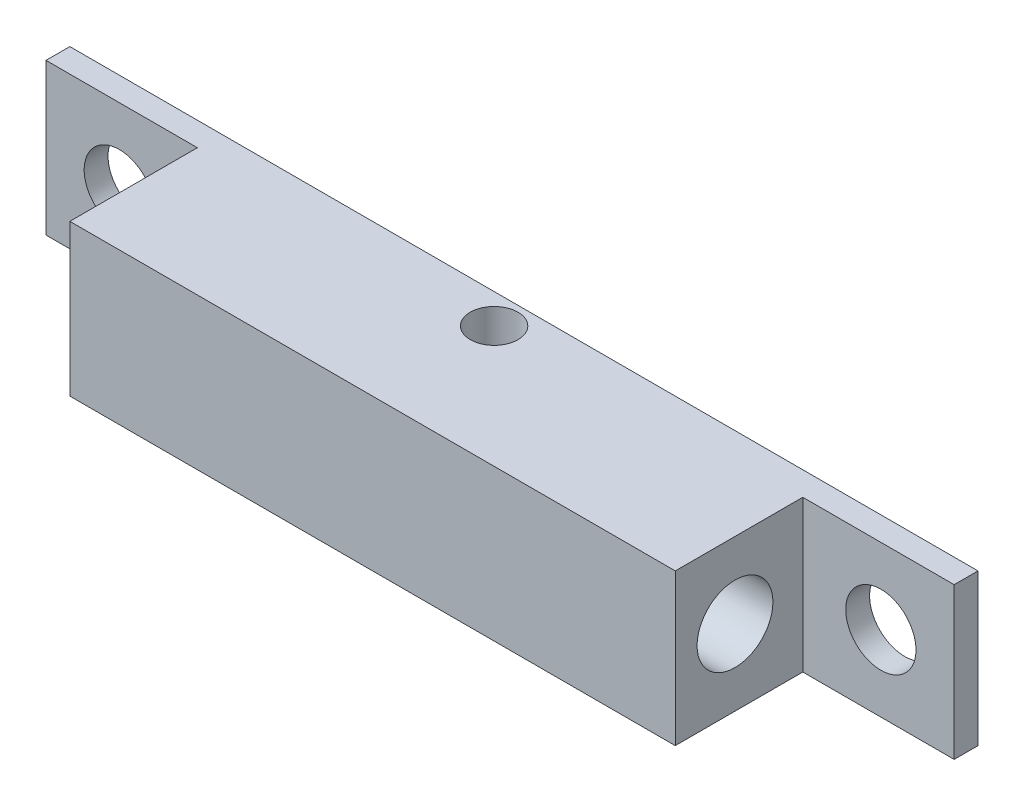
ISO-10303-21;
HEADER;
FILE_DESCRIPTION(('STEP AP214'),'2;1');
FILE_NAME('part.step','',(''),(''),'','','');
FILE_SCHEMA(('AUTOMOTIVE_DESIGN { 1 0 10303 214 1 1 1 1 }'));
ENDSEC;
DATA;
#1=APPLICATION_CONTEXT('core data for automotive mechanical design processes');
#2=APPLICATION_PROTOCOL_DEFINITION('international standard','automotive_design',2000,#1);
#3=PRODUCT_CONTEXT('',#1,'mechanical');
#4=PRODUCT('Part','Part','',(#3));
#5=PRODUCT_RELATED_PRODUCT_CATEGORY('part','',(#4));
#6=PRODUCT_DEFINITION_FORMATION('','',#4);
#7=PRODUCT_DEFINITION_CONTEXT('part definition',#1,'design');
#8=PRODUCT_DEFINITION('design','',#6,#7);
#9=PRODUCT_DEFINITION_SHAPE('','',#8);
#10=(LENGTH_UNIT() NAMED_UNIT(*) SI_UNIT(.MILLI.,.METRE.));
#11=(NAMED_UNIT(*) PLANE_ANGLE_UNIT() SI_UNIT($,.RADIAN.));
#12=(NAMED_UNIT(*) SI_UNIT($,.STERADIAN.) SOLID_ANGLE_UNIT());
#13=UNCERTAINTY_MEASURE_WITH_UNIT(LENGTH_MEASURE(1.E-05),#10,'distance_accuracy_value','');
#14=(GEOMETRIC_REPRESENTATION_CONTEXT(3) GLOBAL_UNCERTAINTY_ASSIGNED_CONTEXT((#13)) GLOBAL_UNIT_ASSIGNED_CONTEXT((#10,
#11,#12)) REPRESENTATION_CONTEXT('',''));
#15=CARTESIAN_POINT('',(0.,0.,0.));
#16=DIRECTION('',(0.,0.,1.));
#17=DIRECTION('',(1.,0.,0.));
#18=AXIS2_PLACEMENT_3D('',#15,#16,#17);
#19=CARTESIAN_POINT('',(0.,0.,1.));
#20=DIRECTION('',(0.,-1.,0.));
#21=DIRECTION('',(0.,0.,-1.));
#22=AXIS2_PLACEMENT_3D('',#19,#20,#21);
#23=PLANE('',#22);
#24=CARTESIAN_POINT('',(12.7,0.,1.25));
#25=DIRECTION('',(0.,1.,0.));
#26=DIRECTION('',(0.,0.,1.));
#27=AXIS2_PLACEMENT_3D('',#24,#25,#26);
#28=CIRCLE('',#27,1.);
#29=CARTESIAN_POINT('',(12.7,0.,2.25));
#30=VERTEX_POINT('',#29);
#31=EDGE_CURVE('E248',#30,#30,#28,.T.);
#32=ORIENTED_EDGE('',*,*,#31,.F.);
#33=EDGE_LOOP('',(#32));
#34=FACE_BOUND('',#33,.T.);
#35=DIRECTION('',(-1.,0.,0.));
#36=VECTOR('',#35,1.);
#37=CARTESIAN_POINT('',(0.,0.,0.));
#38=LINE('',#37,#36);
#39=CARTESIAN_POINT('',(31.75,0.,0.));
#40=VERTEX_POINT('',#39);
#41=CARTESIAN_POINT('',(-6.35,0.,0.));
#42=VERTEX_POINT('',#41);
#43=EDGE_CURVE('E180',#40,#42,#38,.T.);
#44=ORIENTED_EDGE('',*,*,#43,.T.);
#45=DIRECTION('',(0.,0.,-1.));
#46=VECTOR('',#45,1.);
#47=CARTESIAN_POINT('',(-6.35,0.,1.));
#48=LINE('',#47,#46);
#49=CARTESIAN_POINT('',(-6.35,0.,1.));
#50=VERTEX_POINT('',#49);
#51=EDGE_CURVE('E11',#50,#42,#48,.T.);
#52=ORIENTED_EDGE('',*,*,#51,.F.);
#53=DIRECTION('',(-1.,0.,0.));
#54=VECTOR('',#53,1.);
#55=CARTESIAN_POINT('',(0.,0.,1.));
#56=LINE('',#55,#54);
#57=CARTESIAN_POINT('',(0.,0.,1.));
#58=VERTEX_POINT('',#57);
#59=EDGE_CURVE('E66',#58,#50,#56,.T.);
#60=ORIENTED_EDGE('',*,*,#59,.F.);
#61=DIRECTION('',(0.,0.,-1.));
#62=VECTOR('',#61,1.);
#63=CARTESIAN_POINT('',(0.,0.,6.35));
#64=LINE('',#63,#62);
#65=CARTESIAN_POINT('',(0.,0.,6.35));
#66=VERTEX_POINT('',#65);
#67=EDGE_CURVE('E162',#66,#58,#64,.T.);
#68=ORIENTED_EDGE('',*,*,#67,.F.);
#69=DIRECTION('',(1.,0.,0.));
#70=VECTOR('',#69,1.);
#71=CARTESIAN_POINT('',(0.,0.,6.35));
#72=LINE('',#71,#70);
#73=CARTESIAN_POINT('',(25.4,0.,6.35));
#74=VERTEX_POINT('',#73);
#75=EDGE_CURVE('E151',#66,#74,#72,.T.);
#76=ORIENTED_EDGE('',*,*,#75,.T.);
#77=DIRECTION('',(0.,0.,-1.));
#78=VECTOR('',#77,1.);
#79=CARTESIAN_POINT('',(25.4,0.,6.35));
#80=LINE('',#79,#78);
#81=CARTESIAN_POINT('',(25.4,0.,1.));
#82=VERTEX_POINT('',#81);
#83=EDGE_CURVE('E137',#74,#82,#80,.T.);
#84=ORIENTED_EDGE('',*,*,#83,.T.);
#85=DIRECTION('',(1.,0.,0.));
#86=VECTOR('',#85,1.);
#87=CARTESIAN_POINT('',(0.,0.,1.));
#88=LINE('',#87,#86);
#89=CARTESIAN_POINT('',(31.75,0.,1.));
#90=VERTEX_POINT('',#89);
#91=EDGE_CURVE('E130',#82,#90,#88,.T.);
#92=ORIENTED_EDGE('',*,*,#91,.T.);
#93=DIRECTION('',(0.,0.,-1.));
#94=VECTOR('',#93,1.);
#95=CARTESIAN_POINT('',(31.75,0.,1.));
#96=LINE('',#95,#94);
#97=EDGE_CURVE('E115',#90,#40,#96,.T.);
#98=ORIENTED_EDGE('',*,*,#97,.T.);
#99=EDGE_LOOP('',(#44,#52,#60,#68,#76,#84,#92,#98));
#100=FACE_BOUND('',#99,.T.);
#101=ADVANCED_FACE('F42',(#34,#100),#23,.F.);
#102=CARTESIAN_POINT('',(-6.35,0.,1.));
#103=DIRECTION('',(1.,0.,0.));
#104=DIRECTION('',(0.,1.,0.));
#105=AXIS2_PLACEMENT_3D('',#102,#103,#104);
#106=PLANE('',#105);
#107=DIRECTION('',(0.,-1.,0.));
#108=VECTOR('',#107,1.);
#109=CARTESIAN_POINT('',(-6.35,0.,0.));
#110=LINE('',#109,#108);
#111=CARTESIAN_POINT('',(-6.35,-6.35,0.));
#112=VERTEX_POINT('',#111);
#113=EDGE_CURVE('E182',#42,#112,#110,.T.);
#114=ORIENTED_EDGE('',*,*,#113,.T.);
#115=DIRECTION('',(0.,0.,-1.));
#116=VECTOR('',#115,1.);
#117=CARTESIAN_POINT('',(-6.35,-6.35,1.));
#118=LINE('',#117,#116);
#119=CARTESIAN_POINT('',(-6.35,-6.35,1.));
#120=VERTEX_POINT('',#119);
#121=EDGE_CURVE('E50',#120,#112,#118,.T.);
#122=ORIENTED_EDGE('',*,*,#121,.F.);
#123=DIRECTION('',(0.,-1.,0.));
#124=VECTOR('',#123,1.);
#125=CARTESIAN_POINT('',(-6.35,0.,1.));
#126=LINE('',#125,#124);
#127=EDGE_CURVE('E85',#50,#120,#126,.T.);
#128=ORIENTED_EDGE('',*,*,#127,.F.);
#129=ORIENTED_EDGE('',*,*,#51,.T.);
#130=EDGE_LOOP('',(#114,#122,#128,#129));
#131=FACE_BOUND('',#130,.T.);
#132=ADVANCED_FACE('F202',(#131),#106,.F.);
#133=CARTESIAN_POINT('',(0.,-6.35,1.));
#134=DIRECTION('',(0.,-1.,0.));
#135=DIRECTION('',(1.,0.,0.));
#136=AXIS2_PLACEMENT_3D('',#133,#134,#135);
#137=PLANE('',#136);
#138=CARTESIAN_POINT('',(12.7,-6.35,1.25));
#139=DIRECTION('',(0.,-1.,0.));
#140=DIRECTION('',(1.,0.,0.));
#141=AXIS2_PLACEMENT_3D('',#138,#139,#140);
#142=CIRCLE('',#141,1.);
#143=CARTESIAN_POINT('',(13.7,-6.35,1.25));
#144=VERTEX_POINT('',#143);
#145=EDGE_CURVE('E251',#144,#144,#142,.F.);
#146=ORIENTED_EDGE('',*,*,#145,.T.);
#147=EDGE_LOOP('',(#146));
#148=FACE_BOUND('',#147,.T.);
#149=DIRECTION('',(-1.,0.,0.));
#150=VECTOR('',#149,1.);
#151=CARTESIAN_POINT('',(0.,-6.35,0.));
#152=LINE('',#151,#150);
#153=CARTESIAN_POINT('',(31.75,-6.35000000000001,0.));
#154=VERTEX_POINT('',#153);
#155=EDGE_CURVE('E170',#154,#112,#152,.T.);
#156=ORIENTED_EDGE('',*,*,#155,.F.);
#157=DIRECTION('',(0.,0.,-1.));
#158=VECTOR('',#157,1.);
#159=CARTESIAN_POINT('',(31.75,-6.35000000000001,1.));
#160=LINE('',#159,#158);
#161=CARTESIAN_POINT('',(31.75,-6.35000000000001,1.));
#162=VERTEX_POINT('',#161);
#163=EDGE_CURVE('E125',#162,#154,#160,.T.);
#164=ORIENTED_EDGE('',*,*,#163,.F.);
#165=DIRECTION('',(1.,0.,0.));
#166=VECTOR('',#165,1.);
#167=CARTESIAN_POINT('',(0.,-6.35,1.));
#168=LINE('',#167,#166);
#169=CARTESIAN_POINT('',(25.4,-6.35000000000001,1.));
#170=VERTEX_POINT('',#169);
#171=EDGE_CURVE('E132',#170,#162,#168,.T.);
#172=ORIENTED_EDGE('',*,*,#171,.F.);
#173=DIRECTION('',(0.,0.,-1.));
#174=VECTOR('',#173,1.);
#175=CARTESIAN_POINT('',(25.4,-6.35000000000001,6.35));
#176=LINE('',#175,#174);
#177=CARTESIAN_POINT('',(25.4,-6.35000000000001,6.35));
#178=VERTEX_POINT('',#177);
#179=EDGE_CURVE('E157',#178,#170,#176,.T.);
#180=ORIENTED_EDGE('',*,*,#179,.F.);
#181=DIRECTION('',(1.,0.,0.));
#182=VECTOR('',#181,1.);
#183=CARTESIAN_POINT('',(0.,-6.35,6.35));
#184=LINE('',#183,#182);
#185=CARTESIAN_POINT('',(0.,-6.35,6.35));
#186=VERTEX_POINT('',#185);
#187=EDGE_CURVE('E155',#186,#178,#184,.T.);
#188=ORIENTED_EDGE('',*,*,#187,.F.);
#189=DIRECTION('',(0.,0.,-1.));
#190=VECTOR('',#189,1.);
#191=CARTESIAN_POINT('',(0.,-6.35,6.35));
#192=LINE('',#191,#190);
#193=CARTESIAN_POINT('',(0.,-6.35,1.));
#194=VERTEX_POINT('',#193);
#195=EDGE_CURVE('E159',#186,#194,#192,.T.);
#196=ORIENTED_EDGE('',*,*,#195,.T.);
#197=DIRECTION('',(-1.,0.,0.));
#198=VECTOR('',#197,1.);
#199=CARTESIAN_POINT('',(0.,-6.35,1.));
#200=LINE('',#199,#198);
#201=EDGE_CURVE('E173',#194,#120,#200,.T.);
#202=ORIENTED_EDGE('',*,*,#201,.T.);
#203=ORIENTED_EDGE('',*,*,#121,.T.);
#204=EDGE_LOOP('',(#156,#164,#172,#180,#188,#196,#202,#203));
#205=FACE_BOUND('',#204,.T.);
#206=ADVANCED_FACE('F188',(#148,#205),#137,.T.);
#207=CARTESIAN_POINT('',(-3.275,-3.17500000000001,1.));
#208=DIRECTION('',(0.,0.,-1.));
#209=DIRECTION('',(-1.,0.,0.));
#210=AXIS2_PLACEMENT_3D('',#207,#208,#209);
#211=CYLINDRICAL_SURFACE('',#210,1.4732);
#212=CARTESIAN_POINT('',(-3.275,-3.17500000000001,1.));
#213=DIRECTION('',(0.,0.,1.));
#214=DIRECTION('',(1.,0.,0.));
#215=AXIS2_PLACEMENT_3D('',#212,#213,#214);
#216=CIRCLE('',#215,1.4732);
#217=CARTESIAN_POINT('',(-1.8018,-3.17500000000001,1.));
#218=VERTEX_POINT('',#217);
#219=EDGE_CURVE('E167',#218,#218,#216,.T.);
#220=ORIENTED_EDGE('',*,*,#219,.T.);
#221=EDGE_LOOP('',(#220));
#222=FACE_BOUND('',#221,.T.);
#223=CARTESIAN_POINT('',(-3.275,-3.17500000000001,0.));
#224=DIRECTION('',(0.,0.,1.));
#225=DIRECTION('',(1.,0.,0.));
#226=AXIS2_PLACEMENT_3D('',#223,#224,#225);
#227=CIRCLE('',#226,1.4732);
#228=CARTESIAN_POINT('',(-1.8018,-3.17500000000001,0.));
#229=VERTEX_POINT('',#228);
#230=EDGE_CURVE('E166',#229,#229,#227,.T.);
#231=ORIENTED_EDGE('',*,*,#230,.F.);
#232=EDGE_LOOP('',(#231));
#233=FACE_BOUND('',#232,.T.);
#234=ADVANCED_FACE('F44',(#222,#233),#211,.F.);
#235=CARTESIAN_POINT('',(0.,0.,1.));
#236=DIRECTION('',(0.,0.,1.));
#237=DIRECTION('',(1.,0.,0.));
#238=AXIS2_PLACEMENT_3D('',#235,#236,#237);
#239=PLANE('',#238);
#240=ORIENTED_EDGE('',*,*,#219,.F.);
#241=EDGE_LOOP('',(#240));
#242=FACE_BOUND('',#241,.T.);
#243=ORIENTED_EDGE('',*,*,#59,.T.);
#244=ORIENTED_EDGE('',*,*,#127,.T.);
#245=ORIENTED_EDGE('',*,*,#201,.F.);
#246=DIRECTION('',(0.,-1.,0.));
#247=VECTOR('',#246,1.);
#248=CARTESIAN_POINT('',(0.,0.,1.));
#249=LINE('',#248,#247);
#250=EDGE_CURVE('E175',#58,#194,#249,.T.);
#251=ORIENTED_EDGE('',*,*,#250,.F.);
#252=EDGE_LOOP('',(#243,#244,#245,#251));
#253=FACE_BOUND('',#252,.T.);
#254=ADVANCED_FACE('F201',(#242,#253),#239,.T.);
#255=CARTESIAN_POINT('',(0.,0.,0.));
#256=DIRECTION('',(0.,0.,1.));
#257=DIRECTION('',(1.,0.,0.));
#258=AXIS2_PLACEMENT_3D('',#255,#256,#257);
#259=PLANE('',#258);
#260=ORIENTED_EDGE('',*,*,#230,.T.);
#261=EDGE_LOOP('',(#260));
#262=FACE_BOUND('',#261,.T.);
#263=ORIENTED_EDGE('',*,*,#43,.F.);
#264=DIRECTION('',(0.,-1.,0.));
#265=VECTOR('',#264,1.);
#266=CARTESIAN_POINT('',(31.75,0.,0.));
#267=LINE('',#266,#265);
#268=EDGE_CURVE('E121',#40,#154,#267,.T.);
#269=ORIENTED_EDGE('',*,*,#268,.T.);
#270=ORIENTED_EDGE('',*,*,#155,.T.);
#271=ORIENTED_EDGE('',*,*,#113,.F.);
#272=EDGE_LOOP('',(#263,#269,#270,#271));
#273=FACE_BOUND('',#272,.T.);
#274=CARTESIAN_POINT('',(28.675,-3.17500000000001,0.));
#275=DIRECTION('',(0.,0.,1.));
#276=DIRECTION('',(1.,0.,0.));
#277=AXIS2_PLACEMENT_3D('',#274,#275,#276);
#278=CIRCLE('',#277,1.4732);
#279=CARTESIAN_POINT('',(30.1482,-3.17500000000001,0.));
#280=VERTEX_POINT('',#279);
#281=EDGE_CURVE('E143',#280,#280,#278,.T.);
#282=ORIENTED_EDGE('',*,*,#281,.T.);
#283=EDGE_LOOP('',(#282));
#284=FACE_BOUND('',#283,.T.);
#285=ADVANCED_FACE('F186',(#262,#273,#284),#259,.F.);
#286=CARTESIAN_POINT('',(0.,0.,6.35));
#287=DIRECTION('',(1.,0.,0.));
#288=DIRECTION('',(0.,1.,0.));
#289=AXIS2_PLACEMENT_3D('',#286,#287,#288);
#290=PLANE('',#289);
#291=CARTESIAN_POINT('',(0.,-3.175,3.8448));
#292=DIRECTION('',(-1.,0.,0.));
#293=DIRECTION('',(0.,-1.,0.));
#294=AXIS2_PLACEMENT_3D('',#291,#292,#293);
#295=CIRCLE('',#294,1.591);
#296=CARTESIAN_POINT('',(0.,-4.766,3.8448));
#297=VERTEX_POINT('',#296);
#298=EDGE_CURVE('E252',#297,#297,#295,.T.);
#299=ORIENTED_EDGE('',*,*,#298,.F.);
#300=EDGE_LOOP('',(#299));
#301=FACE_BOUND('',#300,.T.);
#302=ORIENTED_EDGE('',*,*,#67,.T.);
#303=ORIENTED_EDGE('',*,*,#250,.T.);
#304=ORIENTED_EDGE('',*,*,#195,.F.);
#305=DIRECTION('',(0.,-1.,0.));
#306=VECTOR('',#305,1.);
#307=CARTESIAN_POINT('',(0.,0.,6.35));
#308=LINE('',#307,#306);
#309=EDGE_CURVE('E153',#66,#186,#308,.T.);
#310=ORIENTED_EDGE('',*,*,#309,.F.);
#311=EDGE_LOOP('',(#302,#303,#304,#310));
#312=FACE_BOUND('',#311,.T.);
#313=ADVANCED_FACE('F199',(#301,#312),#290,.F.);
#314=CARTESIAN_POINT('',(25.4,0.,6.35));
#315=DIRECTION('',(1.,0.,0.));
#316=DIRECTION('',(0.,1.,0.));
#317=AXIS2_PLACEMENT_3D('',#314,#315,#316);
#318=PLANE('',#317);
#319=CARTESIAN_POINT('',(25.4,-3.175,3.8448));
#320=DIRECTION('',(1.,0.,0.));
#321=DIRECTION('',(0.,1.,0.));
#322=AXIS2_PLACEMENT_3D('',#319,#320,#321);
#323=CIRCLE('',#322,1.591);
#324=CARTESIAN_POINT('',(25.4,-1.584,3.8448));
#325=VERTEX_POINT('',#324);
#326=EDGE_CURVE('E146',#325,#325,#323,.F.);
#327=ORIENTED_EDGE('',*,*,#326,.T.);
#328=EDGE_LOOP('',(#327));
#329=FACE_BOUND('',#328,.T.);
#330=DIRECTION('',(0.,-1.,0.));
#331=VECTOR('',#330,1.);
#332=CARTESIAN_POINT('',(25.4,0.,1.));
#333=LINE('',#332,#331);
#334=EDGE_CURVE('E57',#82,#170,#333,.T.);
#335=ORIENTED_EDGE('',*,*,#334,.F.);
#336=ORIENTED_EDGE('',*,*,#83,.F.);
#337=DIRECTION('',(0.,-1.,0.));
#338=VECTOR('',#337,1.);
#339=CARTESIAN_POINT('',(25.4,0.,6.35));
#340=LINE('',#339,#338);
#341=EDGE_CURVE('E124',#74,#178,#340,.T.);
#342=ORIENTED_EDGE('',*,*,#341,.T.);
#343=ORIENTED_EDGE('',*,*,#179,.T.);
#344=EDGE_LOOP('',(#335,#336,#342,#343));
#345=FACE_BOUND('',#344,.T.);
#346=ADVANCED_FACE('F192',(#329,#345),#318,.T.);
#347=CARTESIAN_POINT('',(0.,0.,6.35));
#348=DIRECTION('',(0.,0.,1.));
#349=DIRECTION('',(1.,0.,0.));
#350=AXIS2_PLACEMENT_3D('',#347,#348,#349);
#351=PLANE('',#350);
#352=ORIENTED_EDGE('',*,*,#341,.F.);
#353=ORIENTED_EDGE('',*,*,#75,.F.);
#354=ORIENTED_EDGE('',*,*,#309,.T.);
#355=ORIENTED_EDGE('',*,*,#187,.T.);
#356=EDGE_LOOP('',(#352,#353,#354,#355));
#357=FACE_BOUND('',#356,.T.);
#358=ADVANCED_FACE('F195',(#357),#351,.T.);
#359=CARTESIAN_POINT('',(31.75,0.,1.));
#360=DIRECTION('',(1.,0.,0.));
#361=DIRECTION('',(0.,0.,-1.));
#362=AXIS2_PLACEMENT_3D('',#359,#360,#361);
#363=PLANE('',#362);
#364=ORIENTED_EDGE('',*,*,#268,.F.);
#365=ORIENTED_EDGE('',*,*,#97,.F.);
#366=DIRECTION('',(0.,-1.,0.));
#367=VECTOR('',#366,1.);
#368=CARTESIAN_POINT('',(31.75,0.,1.));
#369=LINE('',#368,#367);
#370=EDGE_CURVE('E119',#90,#162,#369,.T.);
#371=ORIENTED_EDGE('',*,*,#370,.T.);
#372=ORIENTED_EDGE('',*,*,#163,.T.);
#373=EDGE_LOOP('',(#364,#365,#371,#372));
#374=FACE_BOUND('',#373,.T.);
#375=ADVANCED_FACE('F117',(#374),#363,.T.);
#376=CARTESIAN_POINT('',(28.675,-3.17500000000001,1.));
#377=DIRECTION('',(0.,0.,-1.));
#378=DIRECTION('',(-1.,0.,0.));
#379=AXIS2_PLACEMENT_3D('',#376,#377,#378);
#380=CYLINDRICAL_SURFACE('',#379,1.4732);
#381=CARTESIAN_POINT('',(28.675,-3.17500000000001,1.));
#382=DIRECTION('',(0.,0.,1.));
#383=DIRECTION('',(1.,0.,0.));
#384=AXIS2_PLACEMENT_3D('',#381,#382,#383);
#385=CIRCLE('',#384,1.4732);
#386=CARTESIAN_POINT('',(30.1482,-3.17500000000001,1.));
#387=VERTEX_POINT('',#386);
#388=EDGE_CURVE('E134',#387,#387,#385,.T.);
#389=ORIENTED_EDGE('',*,*,#388,.T.);
#390=EDGE_LOOP('',(#389));
#391=FACE_BOUND('',#390,.T.);
#392=ORIENTED_EDGE('',*,*,#281,.F.);
#393=EDGE_LOOP('',(#392));
#394=FACE_BOUND('',#393,.T.);
#395=ADVANCED_FACE('F227',(#391,#394),#380,.F.);
#396=CARTESIAN_POINT('',(0.,0.,1.));
#397=DIRECTION('',(0.,0.,1.));
#398=DIRECTION('',(1.,0.,0.));
#399=AXIS2_PLACEMENT_3D('',#396,#397,#398);
#400=PLANE('',#399);
#401=ORIENTED_EDGE('',*,*,#388,.F.);
#402=EDGE_LOOP('',(#401));
#403=FACE_BOUND('',#402,.T.);
#404=ORIENTED_EDGE('',*,*,#370,.F.);
#405=ORIENTED_EDGE('',*,*,#91,.F.);
#406=ORIENTED_EDGE('',*,*,#334,.T.);
#407=ORIENTED_EDGE('',*,*,#171,.T.);
#408=EDGE_LOOP('',(#404,#405,#406,#407));
#409=FACE_BOUND('',#408,.T.);
#410=ADVANCED_FACE('F129',(#403,#409),#400,.T.);
#411=CARTESIAN_POINT('',(29.9000275554712,-3.175,3.8448));
#412=DIRECTION('',(-1.,0.,0.));
#413=DIRECTION('',(0.,-1.,0.));
#414=AXIS2_PLACEMENT_3D('',#411,#412,#413);
#415=CYLINDRICAL_SURFACE('',#414,1.591);
#416=ORIENTED_EDGE('',*,*,#298,.T.);
#417=EDGE_LOOP('',(#416));
#418=FACE_BOUND('',#417,.T.);
#419=ORIENTED_EDGE('',*,*,#326,.F.);
#420=EDGE_LOOP('',(#419));
#421=FACE_BOUND('',#420,.T.);
#422=ADVANCED_FACE('F235',(#418,#421),#415,.F.);
#423=CARTESIAN_POINT('',(12.7,-9.17842712474619,1.25));
#424=DIRECTION('',(0.,1.,0.));
#425=DIRECTION('',(0.,0.,1.));
#426=AXIS2_PLACEMENT_3D('',#423,#424,#425);
#427=CYLINDRICAL_SURFACE('',#426,1.);
#428=ORIENTED_EDGE('',*,*,#31,.T.);
#429=EDGE_LOOP('',(#428));
#430=FACE_BOUND('',#429,.T.);
#431=ORIENTED_EDGE('',*,*,#145,.F.);
#432=EDGE_LOOP('',(#431));
#433=FACE_BOUND('',#432,.T.);
#434=ADVANCED_FACE('F239',(#430,#433),#427,.F.);
#435=CLOSED_SHELL('',(#101,#132,#206,#234,#254,#285,#313,#346,#358,#375,#395,#410,#422,#434));
#436=MANIFOLD_SOLID_BREP('B2',#435);
#437=ADVANCED_BREP_SHAPE_REPRESENTATION('',(#18,#436),#14);
#438=SHAPE_DEFINITION_REPRESENTATION(#9,#437);
ENDSEC;
END-ISO-10303-21;
